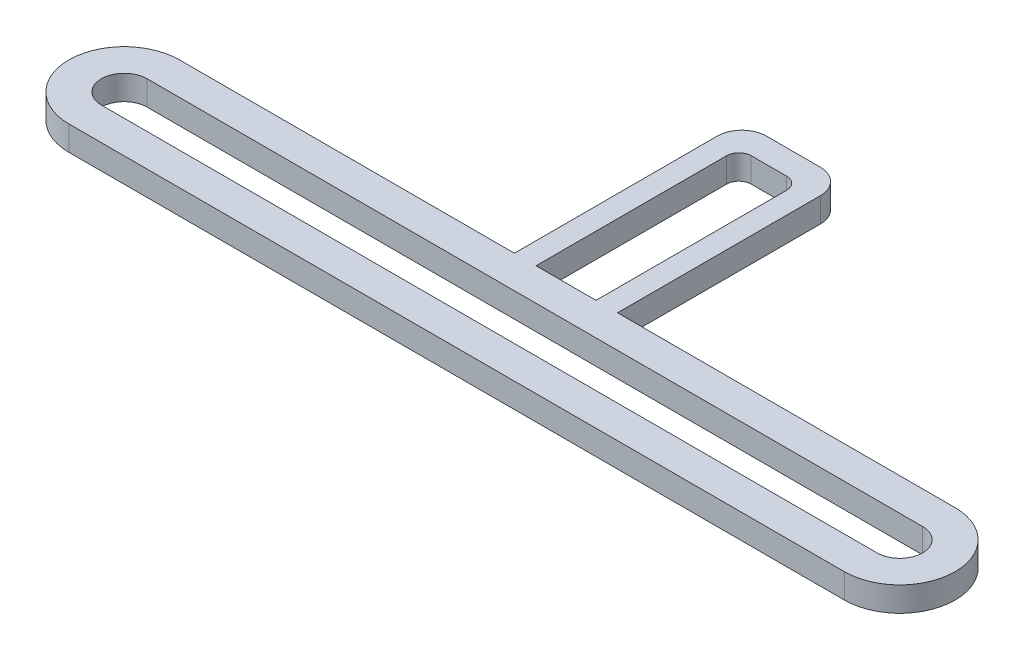
ISO-10303-21;
HEADER;
FILE_DESCRIPTION(('STEP AP214'),'2;1');
FILE_NAME('part.step','',(''),(''),'','','');
FILE_SCHEMA(('AUTOMOTIVE_DESIGN { 1 0 10303 214 1 1 1 1 }'));
ENDSEC;
DATA;
#1=APPLICATION_CONTEXT('core data for automotive mechanical design processes');
#2=APPLICATION_PROTOCOL_DEFINITION('international standard','automotive_design',2000,#1);
#3=PRODUCT_CONTEXT('',#1,'mechanical');
#4=PRODUCT('Part','Part','',(#3));
#5=PRODUCT_RELATED_PRODUCT_CATEGORY('part','',(#4));
#6=PRODUCT_DEFINITION_FORMATION('','',#4);
#7=PRODUCT_DEFINITION_CONTEXT('part definition',#1,'design');
#8=PRODUCT_DEFINITION('design','',#6,#7);
#9=PRODUCT_DEFINITION_SHAPE('','',#8);
#10=(LENGTH_UNIT() NAMED_UNIT(*) SI_UNIT(.MILLI.,.METRE.));
#11=(NAMED_UNIT(*) PLANE_ANGLE_UNIT() SI_UNIT($,.RADIAN.));
#12=(NAMED_UNIT(*) SI_UNIT($,.STERADIAN.) SOLID_ANGLE_UNIT());
#13=UNCERTAINTY_MEASURE_WITH_UNIT(LENGTH_MEASURE(1.E-05),#10,'distance_accuracy_value','');
#14=(GEOMETRIC_REPRESENTATION_CONTEXT(3) GLOBAL_UNCERTAINTY_ASSIGNED_CONTEXT((#13)) GLOBAL_UNIT_ASSIGNED_CONTEXT((#10,
#11,#12)) REPRESENTATION_CONTEXT('',''));
#15=CARTESIAN_POINT('',(0.,0.,0.));
#16=DIRECTION('',(0.,0.,1.));
#17=DIRECTION('',(1.,0.,0.));
#18=AXIS2_PLACEMENT_3D('',#15,#16,#17);
#19=CARTESIAN_POINT('',(-31.8944085465667,2.54,-13.0361355026627));
#20=DIRECTION('',(0.,1.,0.));
#21=DIRECTION('',(0.,0.,1.));
#22=AXIS2_PLACEMENT_3D('',#19,#20,#21);
#23=PLANE('',#22);
#24=CARTESIAN_POINT('',(-31.8944085465667,2.54,-13.0361355026627));
#25=DIRECTION('',(0.,1.,0.));
#26=DIRECTION('',(0.,0.,1.));
#27=AXIS2_PLACEMENT_3D('',#24,#25,#26);
#28=CIRCLE('',#27,5.7185550593657);
#29=CARTESIAN_POINT('',(-31.8944085465667,2.54,-18.7546905620284));
#30=VERTEX_POINT('',#29);
#31=CARTESIAN_POINT('',(-31.8944085465667,2.54,-7.31758044329697));
#32=VERTEX_POINT('',#31);
#33=EDGE_CURVE('E346',#30,#32,#28,.T.);
#34=ORIENTED_EDGE('',*,*,#33,.T.);
#35=DIRECTION('',(1.,0.,0.));
#36=VECTOR('',#35,1.);
#37=CARTESIAN_POINT('',(-31.8944085465667,2.54,-7.31758044329697));
#38=LINE('',#37,#36);
#39=CARTESIAN_POINT('',(48.1634811809157,2.54,-7.31758044329697));
#40=VERTEX_POINT('',#39);
#41=EDGE_CURVE('E351',#32,#40,#38,.T.);
#42=ORIENTED_EDGE('',*,*,#41,.T.);
#43=CARTESIAN_POINT('',(48.1634811809157,2.54,-13.0361355026627));
#44=DIRECTION('',(0.,1.,0.));
#45=DIRECTION('',(0.,0.,1.));
#46=AXIS2_PLACEMENT_3D('',#43,#44,#45);
#47=CIRCLE('',#46,5.7185550593657);
#48=CARTESIAN_POINT('',(48.1634811809157,2.54,-18.7546905620284));
#49=VERTEX_POINT('',#48);
#50=EDGE_CURVE('E353',#40,#49,#47,.T.);
#51=ORIENTED_EDGE('',*,*,#50,.T.);
#52=DIRECTION('',(1.,0.,0.));
#53=VECTOR('',#52,1.);
#54=CARTESIAN_POINT('',(13.3118521904499,2.54,-18.7546905620284));
#55=LINE('',#54,#53);
#56=CARTESIAN_POINT('',(13.3118521904499,2.54,-18.7546905620284));
#57=VERTEX_POINT('',#56);
#58=EDGE_CURVE('E357',#57,#49,#55,.T.);
#59=ORIENTED_EDGE('',*,*,#58,.F.);
#60=DIRECTION('',(0.,0.,-1.));
#61=VECTOR('',#60,1.);
#62=CARTESIAN_POINT('',(13.3118521904499,2.54,-18.7546905620284));
#63=LINE('',#62,#61);
#64=CARTESIAN_POINT('',(13.3118521904499,2.54,-39.6929585233451));
#65=VERTEX_POINT('',#64);
#66=EDGE_CURVE('E356',#57,#65,#63,.T.);
#67=ORIENTED_EDGE('',*,*,#66,.T.);
#68=CARTESIAN_POINT('',(10.7718521904499,2.54,-39.6929585233451));
#69=DIRECTION('',(0.,-1.,0.));
#70=DIRECTION('',(0.,0.,-1.));
#71=AXIS2_PLACEMENT_3D('',#68,#69,#70);
#72=CIRCLE('',#71,2.54);
#73=CARTESIAN_POINT('',(10.7718521904499,2.54,-42.2329585233451));
#74=VERTEX_POINT('',#73);
#75=EDGE_CURVE('E363',#74,#65,#72,.T.);
#76=ORIENTED_EDGE('',*,*,#75,.F.);
#77=DIRECTION('',(1.,0.,0.));
#78=VECTOR('',#77,1.);
#79=CARTESIAN_POINT('',(5.203348375966,2.54,-42.2329585233451));
#80=LINE('',#79,#78);
#81=CARTESIAN_POINT('',(5.203348375966,2.54,-42.2329585233451));
#82=VERTEX_POINT('',#81);
#83=EDGE_CURVE('E365',#82,#74,#80,.T.);
#84=ORIENTED_EDGE('',*,*,#83,.F.);
#85=CARTESIAN_POINT('',(5.20334837596598,2.54,-39.6929585233451));
#86=DIRECTION('',(0.,1.,0.));
#87=DIRECTION('',(0.,0.,1.));
#88=AXIS2_PLACEMENT_3D('',#85,#86,#87);
#89=CIRCLE('',#88,2.54);
#90=CARTESIAN_POINT('',(2.66334837596598,2.54,-39.6929585233451));
#91=VERTEX_POINT('',#90);
#92=EDGE_CURVE('E370',#82,#91,#89,.T.);
#93=ORIENTED_EDGE('',*,*,#92,.T.);
#94=DIRECTION('',(0.,0.,-1.));
#95=VECTOR('',#94,1.);
#96=CARTESIAN_POINT('',(2.66334837596598,2.54,-18.7546905620284));
#97=LINE('',#96,#95);
#98=CARTESIAN_POINT('',(2.66334837596598,2.54,-18.7546905620284));
#99=VERTEX_POINT('',#98);
#100=EDGE_CURVE('E369',#99,#91,#97,.T.);
#101=ORIENTED_EDGE('',*,*,#100,.F.);
#102=DIRECTION('',(1.,0.,0.));
#103=VECTOR('',#102,1.);
#104=CARTESIAN_POINT('',(-31.8944085465667,2.54,-18.7546905620284));
#105=LINE('',#104,#103);
#106=EDGE_CURVE('E375',#30,#99,#105,.T.);
#107=ORIENTED_EDGE('',*,*,#106,.F.);
#108=EDGE_LOOP('',(#34,#42,#51,#59,#67,#76,#84,#93,#101,#107));
#109=FACE_BOUND('',#108,.T.);
#110=DIRECTION('',(0.,0.,-1.));
#111=VECTOR('',#110,1.);
#112=CARTESIAN_POINT('',(11.0866844777407,2.54,-18.7546905620284));
#113=LINE('',#112,#111);
#114=CARTESIAN_POINT('',(11.0866844777407,2.54,-18.7546905620284));
#115=VERTEX_POINT('',#114);
#116=CARTESIAN_POINT('',(11.0866844777407,2.54,-38.4229585233451));
#117=VERTEX_POINT('',#116);
#118=EDGE_CURVE('E304',#115,#117,#113,.T.);
#119=ORIENTED_EDGE('',*,*,#118,.F.);
#120=DIRECTION('',(1.,0.,0.));
#121=VECTOR('',#120,1.);
#122=CARTESIAN_POINT('',(4.90156616485932,2.54,-18.7546905620284));
#123=LINE('',#122,#121);
#124=CARTESIAN_POINT('',(4.90156616485932,2.54,-18.7546905620284));
#125=VERTEX_POINT('',#124);
#126=EDGE_CURVE('E299',#125,#115,#123,.T.);
#127=ORIENTED_EDGE('',*,*,#126,.F.);
#128=DIRECTION('',(0.,0.,-1.));
#129=VECTOR('',#128,1.);
#130=CARTESIAN_POINT('',(4.90156616485932,2.54,-18.7546905620284));
#131=LINE('',#130,#129);
#132=CARTESIAN_POINT('',(4.90156616485932,2.54,-38.4229585233451));
#133=VERTEX_POINT('',#132);
#134=EDGE_CURVE('E314',#125,#133,#131,.T.);
#135=ORIENTED_EDGE('',*,*,#134,.T.);
#136=CARTESIAN_POINT('',(6.17156616485931,2.54,-38.4229585233451));
#137=DIRECTION('',(0.,1.,0.));
#138=DIRECTION('',(0.,0.,1.));
#139=AXIS2_PLACEMENT_3D('',#136,#137,#138);
#140=CIRCLE('',#139,1.27);
#141=CARTESIAN_POINT('',(6.17156616485932,2.54,-39.6929585233451));
#142=VERTEX_POINT('',#141);
#143=EDGE_CURVE('E313',#142,#133,#140,.T.);
#144=ORIENTED_EDGE('',*,*,#143,.F.);
#145=DIRECTION('',(1.,0.,0.));
#146=VECTOR('',#145,1.);
#147=CARTESIAN_POINT('',(6.17156616485932,2.54,-39.6929585233451));
#148=LINE('',#147,#146);
#149=CARTESIAN_POINT('',(9.81668447774072,2.54,-39.6929585233451));
#150=VERTEX_POINT('',#149);
#151=EDGE_CURVE('E306',#142,#150,#148,.T.);
#152=ORIENTED_EDGE('',*,*,#151,.T.);
#153=CARTESIAN_POINT('',(9.81668447774073,2.54,-38.4229585233451));
#154=DIRECTION('',(0.,-1.,0.));
#155=DIRECTION('',(0.,0.,-1.));
#156=AXIS2_PLACEMENT_3D('',#153,#154,#155);
#157=CIRCLE('',#156,1.27);
#158=EDGE_CURVE('E303',#150,#117,#157,.T.);
#159=ORIENTED_EDGE('',*,*,#158,.T.);
#160=EDGE_LOOP('',(#119,#127,#135,#144,#152,#159));
#161=FACE_BOUND('',#160,.T.);
#162=DIRECTION('',(1.,0.,0.));
#163=VECTOR('',#162,1.);
#164=CARTESIAN_POINT('',(-31.8944085465667,2.54,-10.6784856097663));
#165=LINE('',#164,#163);
#166=CARTESIAN_POINT('',(-31.8944085465667,2.54,-10.6784856097663));
#167=VERTEX_POINT('',#166);
#168=CARTESIAN_POINT('',(48.1634811809157,2.54,-10.6784856097663));
#169=VERTEX_POINT('',#168);
#170=EDGE_CURVE('E272',#167,#169,#165,.T.);
#171=ORIENTED_EDGE('',*,*,#170,.F.);
#172=CARTESIAN_POINT('',(-31.8944085465667,2.54,-13.0361355026627));
#173=DIRECTION('',(0.,1.,0.));
#174=DIRECTION('',(0.,0.,1.));
#175=AXIS2_PLACEMENT_3D('',#172,#173,#174);
#176=CIRCLE('',#175,2.35764989289636);
#177=CARTESIAN_POINT('',(-31.8944085465667,2.54,-15.393785395559));
#178=VERTEX_POINT('',#177);
#179=EDGE_CURVE('E264',#178,#167,#176,.T.);
#180=ORIENTED_EDGE('',*,*,#179,.F.);
#181=DIRECTION('',(1.,0.,0.));
#182=VECTOR('',#181,1.);
#183=CARTESIAN_POINT('',(-31.8944085465667,2.54,-15.393785395559));
#184=LINE('',#183,#182);
#185=CARTESIAN_POINT('',(48.1634811809157,2.54,-15.393785395559));
#186=VERTEX_POINT('',#185);
#187=EDGE_CURVE('E289',#178,#186,#184,.T.);
#188=ORIENTED_EDGE('',*,*,#187,.T.);
#189=CARTESIAN_POINT('',(48.1634811809157,2.54,-13.0361355026627));
#190=DIRECTION('',(0.,1.,0.));
#191=DIRECTION('',(0.,0.,1.));
#192=AXIS2_PLACEMENT_3D('',#189,#190,#191);
#193=CIRCLE('',#192,2.35764989289636);
#194=EDGE_CURVE('E284',#169,#186,#193,.T.);
#195=ORIENTED_EDGE('',*,*,#194,.F.);
#196=EDGE_LOOP('',(#171,#180,#188,#195));
#197=FACE_BOUND('',#196,.T.);
#198=ADVANCED_FACE('F126',(#109,#161,#197),#23,.T.);
#199=CARTESIAN_POINT('',(-31.8944085465667,0.,-13.0361355026627));
#200=DIRECTION('',(0.,1.,0.));
#201=DIRECTION('',(0.,0.,1.));
#202=AXIS2_PLACEMENT_3D('',#199,#200,#201);
#203=PLANE('',#202);
#204=DIRECTION('',(1.,0.,0.));
#205=VECTOR('',#204,1.);
#206=CARTESIAN_POINT('',(4.90156616485932,0.,-18.7546905620284));
#207=LINE('',#206,#205);
#208=CARTESIAN_POINT('',(4.90156616485932,0.,-18.7546905620284));
#209=VERTEX_POINT('',#208);
#210=CARTESIAN_POINT('',(11.0866844777407,0.,-18.7546905620284));
#211=VERTEX_POINT('',#210);
#212=EDGE_CURVE('E281',#209,#211,#207,.T.);
#213=ORIENTED_EDGE('',*,*,#212,.T.);
#214=DIRECTION('',(0.,0.,-1.));
#215=VECTOR('',#214,1.);
#216=CARTESIAN_POINT('',(11.0866844777407,0.,-18.7546905620284));
#217=LINE('',#216,#215);
#218=CARTESIAN_POINT('',(11.0866844777407,0.,-38.4229585233451));
#219=VERTEX_POINT('',#218);
#220=EDGE_CURVE('E319',#211,#219,#217,.T.);
#221=ORIENTED_EDGE('',*,*,#220,.T.);
#222=CARTESIAN_POINT('',(9.81668447774073,0.,-38.4229585233451));
#223=DIRECTION('',(0.,-1.,0.));
#224=DIRECTION('',(0.,0.,-1.));
#225=AXIS2_PLACEMENT_3D('',#222,#223,#224);
#226=CIRCLE('',#225,1.27);
#227=CARTESIAN_POINT('',(9.81668447774072,0.,-39.6929585233451));
#228=VERTEX_POINT('',#227);
#229=EDGE_CURVE('E323',#228,#219,#226,.T.);
#230=ORIENTED_EDGE('',*,*,#229,.F.);
#231=DIRECTION('',(1.,0.,0.));
#232=VECTOR('',#231,1.);
#233=CARTESIAN_POINT('',(6.17156616485932,0.,-39.6929585233451));
#234=LINE('',#233,#232);
#235=CARTESIAN_POINT('',(6.17156616485932,0.,-39.6929585233451));
#236=VERTEX_POINT('',#235);
#237=EDGE_CURVE('E326',#236,#228,#234,.T.);
#238=ORIENTED_EDGE('',*,*,#237,.F.);
#239=CARTESIAN_POINT('',(6.17156616485931,0.,-38.4229585233451));
#240=DIRECTION('',(0.,1.,0.));
#241=DIRECTION('',(0.,0.,1.));
#242=AXIS2_PLACEMENT_3D('',#239,#240,#241);
#243=CIRCLE('',#242,1.27);
#244=CARTESIAN_POINT('',(4.90156616485932,0.,-38.4229585233451));
#245=VERTEX_POINT('',#244);
#246=EDGE_CURVE('E328',#236,#245,#243,.T.);
#247=ORIENTED_EDGE('',*,*,#246,.T.);
#248=DIRECTION('',(0.,0.,-1.));
#249=VECTOR('',#248,1.);
#250=CARTESIAN_POINT('',(4.90156616485932,0.,-18.7546905620284));
#251=LINE('',#250,#249);
#252=EDGE_CURVE('E305',#209,#245,#251,.T.);
#253=ORIENTED_EDGE('',*,*,#252,.F.);
#254=EDGE_LOOP('',(#213,#221,#230,#238,#247,#253));
#255=FACE_BOUND('',#254,.T.);
#256=CARTESIAN_POINT('',(-31.8944085465667,0.,-13.0361355026627));
#257=DIRECTION('',(0.,1.,0.));
#258=DIRECTION('',(0.,0.,1.));
#259=AXIS2_PLACEMENT_3D('',#256,#257,#258);
#260=CIRCLE('',#259,5.7185550593657);
#261=CARTESIAN_POINT('',(-31.8944085465667,0.,-18.7546905620284));
#262=VERTEX_POINT('',#261);
#263=CARTESIAN_POINT('',(-31.8944085465667,0.,-7.31758044329697));
#264=VERTEX_POINT('',#263);
#265=EDGE_CURVE('E350',#262,#264,#260,.T.);
#266=ORIENTED_EDGE('',*,*,#265,.F.);
#267=DIRECTION('',(1.,0.,0.));
#268=VECTOR('',#267,1.);
#269=CARTESIAN_POINT('',(-31.8944085465667,0.,-18.7546905620284));
#270=LINE('',#269,#268);
#271=CARTESIAN_POINT('',(2.66334837596598,0.,-18.7546905620284));
#272=VERTEX_POINT('',#271);
#273=EDGE_CURVE('E355',#262,#272,#270,.T.);
#274=ORIENTED_EDGE('',*,*,#273,.T.);
#275=DIRECTION('',(0.,0.,-1.));
#276=VECTOR('',#275,1.);
#277=CARTESIAN_POINT('',(2.66334837596598,0.,-18.7546905620284));
#278=LINE('',#277,#276);
#279=CARTESIAN_POINT('',(2.66334837596598,0.,-39.6929585233451));
#280=VERTEX_POINT('',#279);
#281=EDGE_CURVE('E400',#272,#280,#278,.T.);
#282=ORIENTED_EDGE('',*,*,#281,.T.);
#283=CARTESIAN_POINT('',(5.20334837596598,0.,-39.6929585233451));
#284=DIRECTION('',(0.,1.,0.));
#285=DIRECTION('',(0.,0.,1.));
#286=AXIS2_PLACEMENT_3D('',#283,#284,#285);
#287=CIRCLE('',#286,2.54);
#288=CARTESIAN_POINT('',(5.203348375966,0.,-42.2329585233451));
#289=VERTEX_POINT('',#288);
#290=EDGE_CURVE('E394',#289,#280,#287,.T.);
#291=ORIENTED_EDGE('',*,*,#290,.F.);
#292=DIRECTION('',(1.,0.,0.));
#293=VECTOR('',#292,1.);
#294=CARTESIAN_POINT('',(5.203348375966,0.,-42.2329585233451));
#295=LINE('',#294,#293);
#296=CARTESIAN_POINT('',(10.7718521904499,0.,-42.2329585233451));
#297=VERTEX_POINT('',#296);
#298=EDGE_CURVE('E395',#289,#297,#295,.T.);
#299=ORIENTED_EDGE('',*,*,#298,.T.);
#300=CARTESIAN_POINT('',(10.7718521904499,0.,-39.6929585233451));
#301=DIRECTION('',(0.,-1.,0.));
#302=DIRECTION('',(0.,0.,-1.));
#303=AXIS2_PLACEMENT_3D('',#300,#301,#302);
#304=CIRCLE('',#303,2.54);
#305=CARTESIAN_POINT('',(13.3118521904499,0.,-39.6929585233451));
#306=VERTEX_POINT('',#305);
#307=EDGE_CURVE('E386',#297,#306,#304,.T.);
#308=ORIENTED_EDGE('',*,*,#307,.T.);
#309=DIRECTION('',(0.,0.,-1.));
#310=VECTOR('',#309,1.);
#311=CARTESIAN_POINT('',(13.3118521904499,0.,-18.7546905620284));
#312=LINE('',#311,#310);
#313=CARTESIAN_POINT('',(13.3118521904499,0.,-18.7546905620284));
#314=VERTEX_POINT('',#313);
#315=EDGE_CURVE('E387',#314,#306,#312,.T.);
#316=ORIENTED_EDGE('',*,*,#315,.F.);
#317=DIRECTION('',(1.,0.,0.));
#318=VECTOR('',#317,1.);
#319=CARTESIAN_POINT('',(13.3118521904499,0.,-18.7546905620284));
#320=LINE('',#319,#318);
#321=CARTESIAN_POINT('',(48.1634811809157,0.,-18.7546905620284));
#322=VERTEX_POINT('',#321);
#323=EDGE_CURVE('E382',#314,#322,#320,.T.);
#324=ORIENTED_EDGE('',*,*,#323,.T.);
#325=CARTESIAN_POINT('',(48.1634811809157,0.,-13.0361355026627));
#326=DIRECTION('',(0.,1.,0.));
#327=DIRECTION('',(0.,0.,1.));
#328=AXIS2_PLACEMENT_3D('',#325,#326,#327);
#329=CIRCLE('',#328,5.7185550593657);
#330=CARTESIAN_POINT('',(48.1634811809157,0.,-7.31758044329697));
#331=VERTEX_POINT('',#330);
#332=EDGE_CURVE('E379',#331,#322,#329,.T.);
#333=ORIENTED_EDGE('',*,*,#332,.F.);
#334=DIRECTION('',(1.,0.,0.));
#335=VECTOR('',#334,1.);
#336=CARTESIAN_POINT('',(-31.8944085465667,0.,-7.31758044329697));
#337=LINE('',#336,#335);
#338=EDGE_CURVE('E378',#264,#331,#337,.T.);
#339=ORIENTED_EDGE('',*,*,#338,.F.);
#340=EDGE_LOOP('',(#266,#274,#282,#291,#299,#308,#316,#324,#333,#339));
#341=FACE_BOUND('',#340,.T.);
#342=CARTESIAN_POINT('',(-31.8944085465667,0.,-13.0361355026627));
#343=DIRECTION('',(0.,1.,0.));
#344=DIRECTION('',(0.,0.,1.));
#345=AXIS2_PLACEMENT_3D('',#342,#343,#344);
#346=CIRCLE('',#345,2.35764989289636);
#347=CARTESIAN_POINT('',(-31.8944085465667,0.,-15.393785395559));
#348=VERTEX_POINT('',#347);
#349=CARTESIAN_POINT('',(-31.8944085465667,0.,-10.6784856097663));
#350=VERTEX_POINT('',#349);
#351=EDGE_CURVE('E151',#348,#350,#346,.T.);
#352=ORIENTED_EDGE('',*,*,#351,.T.);
#353=DIRECTION('',(1.,0.,0.));
#354=VECTOR('',#353,1.);
#355=CARTESIAN_POINT('',(-31.8944085465667,0.,-10.6784856097663));
#356=LINE('',#355,#354);
#357=CARTESIAN_POINT('',(48.1634811809157,0.,-10.6784856097663));
#358=VERTEX_POINT('',#357);
#359=EDGE_CURVE('E278',#350,#358,#356,.T.);
#360=ORIENTED_EDGE('',*,*,#359,.T.);
#361=CARTESIAN_POINT('',(48.1634811809157,0.,-13.0361355026627));
#362=DIRECTION('',(0.,1.,0.));
#363=DIRECTION('',(0.,0.,1.));
#364=AXIS2_PLACEMENT_3D('',#361,#362,#363);
#365=CIRCLE('',#364,2.35764989289636);
#366=CARTESIAN_POINT('',(48.1634811809157,0.,-15.393785395559));
#367=VERTEX_POINT('',#366);
#368=EDGE_CURVE('E291',#358,#367,#365,.T.);
#369=ORIENTED_EDGE('',*,*,#368,.T.);
#370=DIRECTION('',(1.,0.,0.));
#371=VECTOR('',#370,1.);
#372=CARTESIAN_POINT('',(-31.8944085465667,0.,-15.393785395559));
#373=LINE('',#372,#371);
#374=EDGE_CURVE('E273',#348,#367,#373,.T.);
#375=ORIENTED_EDGE('',*,*,#374,.F.);
#376=EDGE_LOOP('',(#352,#360,#369,#375));
#377=FACE_BOUND('',#376,.T.);
#378=ADVANCED_FACE('F430',(#255,#341,#377),#203,.F.);
#379=CARTESIAN_POINT('',(-31.8944085465667,2.54,-13.0361355026627));
#380=DIRECTION('',(0.,-1.,0.));
#381=DIRECTION('',(0.,0.,-1.));
#382=AXIS2_PLACEMENT_3D('',#379,#380,#381);
#383=CYLINDRICAL_SURFACE('',#382,5.7185550593657);
#384=ORIENTED_EDGE('',*,*,#265,.T.);
#385=DIRECTION('',(0.,-1.,0.));
#386=VECTOR('',#385,1.);
#387=CARTESIAN_POINT('',(-31.8944085465667,2.54,-7.31758044329697));
#388=LINE('',#387,#386);
#389=EDGE_CURVE('E12',#32,#264,#388,.T.);
#390=ORIENTED_EDGE('',*,*,#389,.F.);
#391=ORIENTED_EDGE('',*,*,#33,.F.);
#392=DIRECTION('',(0.,-1.,0.));
#393=VECTOR('',#392,1.);
#394=CARTESIAN_POINT('',(-31.8944085465667,2.54,-18.7546905620284));
#395=LINE('',#394,#393);
#396=EDGE_CURVE('E374',#30,#262,#395,.T.);
#397=ORIENTED_EDGE('',*,*,#396,.T.);
#398=EDGE_LOOP('',(#384,#390,#391,#397));
#399=FACE_BOUND('',#398,.T.);
#400=ADVANCED_FACE('F128',(#399),#383,.T.);
#401=CARTESIAN_POINT('',(-31.8944085465667,2.54,-7.31758044329697));
#402=DIRECTION('',(0.,0.,-1.));
#403=DIRECTION('',(-1.,0.,0.));
#404=AXIS2_PLACEMENT_3D('',#401,#402,#403);
#405=PLANE('',#404);
#406=ORIENTED_EDGE('',*,*,#338,.T.);
#407=DIRECTION('',(0.,-1.,0.));
#408=VECTOR('',#407,1.);
#409=CARTESIAN_POINT('',(48.1634811809157,2.54,-7.31758044329697));
#410=LINE('',#409,#408);
#411=EDGE_CURVE('E137',#40,#331,#410,.T.);
#412=ORIENTED_EDGE('',*,*,#411,.F.);
#413=ORIENTED_EDGE('',*,*,#41,.F.);
#414=ORIENTED_EDGE('',*,*,#389,.T.);
#415=EDGE_LOOP('',(#406,#412,#413,#414));
#416=FACE_BOUND('',#415,.T.);
#417=ADVANCED_FACE('F445',(#416),#405,.F.);
#418=CARTESIAN_POINT('',(48.1634811809157,2.54,-13.0361355026627));
#419=DIRECTION('',(0.,-1.,0.));
#420=DIRECTION('',(0.,0.,-1.));
#421=AXIS2_PLACEMENT_3D('',#418,#419,#420);
#422=CYLINDRICAL_SURFACE('',#421,5.7185550593657);
#423=ORIENTED_EDGE('',*,*,#332,.T.);
#424=DIRECTION('',(0.,-1.,0.));
#425=VECTOR('',#424,1.);
#426=CARTESIAN_POINT('',(48.1634811809157,2.54,-18.7546905620284));
#427=LINE('',#426,#425);
#428=EDGE_CURVE('E418',#49,#322,#427,.T.);
#429=ORIENTED_EDGE('',*,*,#428,.F.);
#430=ORIENTED_EDGE('',*,*,#50,.F.);
#431=ORIENTED_EDGE('',*,*,#411,.T.);
#432=EDGE_LOOP('',(#423,#429,#430,#431));
#433=FACE_BOUND('',#432,.T.);
#434=ADVANCED_FACE('F425',(#433),#422,.T.);
#435=CARTESIAN_POINT('',(13.3118521904499,2.54,-18.7546905620284));
#436=DIRECTION('',(0.,0.,-1.));
#437=DIRECTION('',(-1.,0.,0.));
#438=AXIS2_PLACEMENT_3D('',#435,#436,#437);
#439=PLANE('',#438);
#440=ORIENTED_EDGE('',*,*,#323,.F.);
#441=DIRECTION('',(0.,-1.,0.));
#442=VECTOR('',#441,1.);
#443=CARTESIAN_POINT('',(13.3118521904499,2.54,-18.7546905620284));
#444=LINE('',#443,#442);
#445=EDGE_CURVE('E411',#57,#314,#444,.T.);
#446=ORIENTED_EDGE('',*,*,#445,.F.);
#447=ORIENTED_EDGE('',*,*,#58,.T.);
#448=ORIENTED_EDGE('',*,*,#428,.T.);
#449=EDGE_LOOP('',(#440,#446,#447,#448));
#450=FACE_BOUND('',#449,.T.);
#451=ADVANCED_FACE('F435',(#450),#439,.T.);
#452=CARTESIAN_POINT('',(13.3118521904499,2.54,-18.7546905620284));
#453=DIRECTION('',(-1.,0.,0.));
#454=DIRECTION('',(0.,0.,1.));
#455=AXIS2_PLACEMENT_3D('',#452,#453,#454);
#456=PLANE('',#455);
#457=ORIENTED_EDGE('',*,*,#315,.T.);
#458=DIRECTION('',(0.,-1.,0.));
#459=VECTOR('',#458,1.);
#460=CARTESIAN_POINT('',(13.3118521904499,2.54,-39.6929585233451));
#461=LINE('',#460,#459);
#462=EDGE_CURVE('E414',#65,#306,#461,.T.);
#463=ORIENTED_EDGE('',*,*,#462,.F.);
#464=ORIENTED_EDGE('',*,*,#66,.F.);
#465=ORIENTED_EDGE('',*,*,#445,.T.);
#466=EDGE_LOOP('',(#457,#463,#464,#465));
#467=FACE_BOUND('',#466,.T.);
#468=ADVANCED_FACE('F462',(#467),#456,.F.);
#469=CARTESIAN_POINT('',(10.7718521904499,2.54,-39.6929585233451));
#470=DIRECTION('',(0.,-1.,0.));
#471=DIRECTION('',(0.,0.,-1.));
#472=AXIS2_PLACEMENT_3D('',#469,#470,#471);
#473=CYLINDRICAL_SURFACE('',#472,2.54);
#474=ORIENTED_EDGE('',*,*,#307,.F.);
#475=DIRECTION('',(0.,-1.,0.));
#476=VECTOR('',#475,1.);
#477=CARTESIAN_POINT('',(10.7718521904499,2.54,-42.2329585233451));
#478=LINE('',#477,#476);
#479=EDGE_CURVE('E409',#74,#297,#478,.T.);
#480=ORIENTED_EDGE('',*,*,#479,.F.);
#481=ORIENTED_EDGE('',*,*,#75,.T.);
#482=ORIENTED_EDGE('',*,*,#462,.T.);
#483=EDGE_LOOP('',(#474,#480,#481,#482));
#484=FACE_BOUND('',#483,.T.);
#485=ADVANCED_FACE('F461',(#484),#473,.T.);
#486=CARTESIAN_POINT('',(5.203348375966,2.54,-42.2329585233451));
#487=DIRECTION('',(0.,0.,-1.));
#488=DIRECTION('',(-1.,0.,0.));
#489=AXIS2_PLACEMENT_3D('',#486,#487,#488);
#490=PLANE('',#489);
#491=ORIENTED_EDGE('',*,*,#298,.F.);
#492=DIRECTION('',(0.,-1.,0.));
#493=VECTOR('',#492,1.);
#494=CARTESIAN_POINT('',(5.203348375966,2.54,-42.2329585233451));
#495=LINE('',#494,#493);
#496=EDGE_CURVE('E407',#82,#289,#495,.T.);
#497=ORIENTED_EDGE('',*,*,#496,.F.);
#498=ORIENTED_EDGE('',*,*,#83,.T.);
#499=ORIENTED_EDGE('',*,*,#479,.T.);
#500=EDGE_LOOP('',(#491,#497,#498,#499));
#501=FACE_BOUND('',#500,.T.);
#502=ADVANCED_FACE('F457',(#501),#490,.T.);
#503=CARTESIAN_POINT('',(5.20334837596598,2.54,-39.6929585233451));
#504=DIRECTION('',(0.,-1.,0.));
#505=DIRECTION('',(0.,0.,-1.));
#506=AXIS2_PLACEMENT_3D('',#503,#504,#505);
#507=CYLINDRICAL_SURFACE('',#506,2.54);
#508=ORIENTED_EDGE('',*,*,#290,.T.);
#509=DIRECTION('',(0.,-1.,0.));
#510=VECTOR('',#509,1.);
#511=CARTESIAN_POINT('',(2.66334837596598,2.54,-39.6929585233451));
#512=LINE('',#511,#510);
#513=EDGE_CURVE('E406',#91,#280,#512,.T.);
#514=ORIENTED_EDGE('',*,*,#513,.F.);
#515=ORIENTED_EDGE('',*,*,#92,.F.);
#516=ORIENTED_EDGE('',*,*,#496,.T.);
#517=EDGE_LOOP('',(#508,#514,#515,#516));
#518=FACE_BOUND('',#517,.T.);
#519=ADVANCED_FACE('F490',(#518),#507,.T.);
#520=CARTESIAN_POINT('',(2.66334837596598,2.54,-18.7546905620284));
#521=DIRECTION('',(-1.,0.,0.));
#522=DIRECTION('',(0.,0.,1.));
#523=AXIS2_PLACEMENT_3D('',#520,#521,#522);
#524=PLANE('',#523);
#525=ORIENTED_EDGE('',*,*,#281,.F.);
#526=DIRECTION('',(0.,-1.,0.));
#527=VECTOR('',#526,1.);
#528=CARTESIAN_POINT('',(2.66334837596598,2.54,-18.7546905620284));
#529=LINE('',#528,#527);
#530=EDGE_CURVE('E404',#99,#272,#529,.T.);
#531=ORIENTED_EDGE('',*,*,#530,.F.);
#532=ORIENTED_EDGE('',*,*,#100,.T.);
#533=ORIENTED_EDGE('',*,*,#513,.T.);
#534=EDGE_LOOP('',(#525,#531,#532,#533));
#535=FACE_BOUND('',#534,.T.);
#536=ADVANCED_FACE('F449',(#535),#524,.T.);
#537=CARTESIAN_POINT('',(-31.8944085465667,2.54,-18.7546905620284));
#538=DIRECTION('',(0.,0.,-1.));
#539=DIRECTION('',(-1.,0.,0.));
#540=AXIS2_PLACEMENT_3D('',#537,#538,#539);
#541=PLANE('',#540);
#542=ORIENTED_EDGE('',*,*,#273,.F.);
#543=ORIENTED_EDGE('',*,*,#396,.F.);
#544=ORIENTED_EDGE('',*,*,#106,.T.);
#545=ORIENTED_EDGE('',*,*,#530,.T.);
#546=EDGE_LOOP('',(#542,#543,#544,#545));
#547=FACE_BOUND('',#546,.T.);
#548=ADVANCED_FACE('F446',(#547),#541,.T.);
#549=CARTESIAN_POINT('',(4.90156616485932,2.54,-18.7546905620284));
#550=DIRECTION('',(0.,0.,-1.));
#551=DIRECTION('',(-1.,0.,0.));
#552=AXIS2_PLACEMENT_3D('',#549,#550,#551);
#553=PLANE('',#552);
#554=ORIENTED_EDGE('',*,*,#212,.F.);
#555=DIRECTION('',(0.,-1.,0.));
#556=VECTOR('',#555,1.);
#557=CARTESIAN_POINT('',(4.90156616485932,2.54,-18.7546905620284));
#558=LINE('',#557,#556);
#559=EDGE_CURVE('E320',#125,#209,#558,.T.);
#560=ORIENTED_EDGE('',*,*,#559,.F.);
#561=ORIENTED_EDGE('',*,*,#126,.T.);
#562=DIRECTION('',(0.,-1.,0.));
#563=VECTOR('',#562,1.);
#564=CARTESIAN_POINT('',(11.0866844777407,2.54,-18.7546905620284));
#565=LINE('',#564,#563);
#566=EDGE_CURVE('E341',#115,#211,#565,.T.);
#567=ORIENTED_EDGE('',*,*,#566,.T.);
#568=EDGE_LOOP('',(#554,#560,#561,#567));
#569=FACE_BOUND('',#568,.T.);
#570=ADVANCED_FACE('F477',(#569),#553,.T.);
#571=CARTESIAN_POINT('',(11.0866844777407,2.54,-18.7546905620284));
#572=DIRECTION('',(-1.,0.,0.));
#573=DIRECTION('',(0.,0.,1.));
#574=AXIS2_PLACEMENT_3D('',#571,#572,#573);
#575=PLANE('',#574);
#576=ORIENTED_EDGE('',*,*,#220,.F.);
#577=ORIENTED_EDGE('',*,*,#566,.F.);
#578=ORIENTED_EDGE('',*,*,#118,.T.);
#579=DIRECTION('',(0.,-1.,0.));
#580=VECTOR('',#579,1.);
#581=CARTESIAN_POINT('',(11.0866844777407,2.54,-38.4229585233451));
#582=LINE('',#581,#580);
#583=EDGE_CURVE('E344',#117,#219,#582,.T.);
#584=ORIENTED_EDGE('',*,*,#583,.T.);
#585=EDGE_LOOP('',(#576,#577,#578,#584));
#586=FACE_BOUND('',#585,.T.);
#587=ADVANCED_FACE('F520',(#586),#575,.T.);
#588=CARTESIAN_POINT('',(9.81668447774073,2.54,-38.4229585233451));
#589=DIRECTION('',(0.,-1.,0.));
#590=DIRECTION('',(0.,0.,-1.));
#591=AXIS2_PLACEMENT_3D('',#588,#589,#590);
#592=CYLINDRICAL_SURFACE('',#591,1.27);
#593=ORIENTED_EDGE('',*,*,#229,.T.);
#594=ORIENTED_EDGE('',*,*,#583,.F.);
#595=ORIENTED_EDGE('',*,*,#158,.F.);
#596=DIRECTION('',(0.,-1.,0.));
#597=VECTOR('',#596,1.);
#598=CARTESIAN_POINT('',(9.81668447774072,2.54,-39.6929585233451));
#599=LINE('',#598,#597);
#600=EDGE_CURVE('E339',#150,#228,#599,.T.);
#601=ORIENTED_EDGE('',*,*,#600,.T.);
#602=EDGE_LOOP('',(#593,#594,#595,#601));
#603=FACE_BOUND('',#602,.T.);
#604=ADVANCED_FACE('F523',(#603),#592,.F.);
#605=CARTESIAN_POINT('',(6.17156616485932,2.54,-39.6929585233451));
#606=DIRECTION('',(0.,0.,-1.));
#607=DIRECTION('',(-1.,0.,0.));
#608=AXIS2_PLACEMENT_3D('',#605,#606,#607);
#609=PLANE('',#608);
#610=ORIENTED_EDGE('',*,*,#237,.T.);
#611=ORIENTED_EDGE('',*,*,#600,.F.);
#612=ORIENTED_EDGE('',*,*,#151,.F.);
#613=DIRECTION('',(0.,-1.,0.));
#614=VECTOR('',#613,1.);
#615=CARTESIAN_POINT('',(6.17156616485932,2.54,-39.6929585233451));
#616=LINE('',#615,#614);
#617=EDGE_CURVE('E337',#142,#236,#616,.T.);
#618=ORIENTED_EDGE('',*,*,#617,.T.);
#619=EDGE_LOOP('',(#610,#611,#612,#618));
#620=FACE_BOUND('',#619,.T.);
#621=ADVANCED_FACE('F531',(#620),#609,.F.);
#622=CARTESIAN_POINT('',(6.17156616485931,2.54,-38.4229585233451));
#623=DIRECTION('',(0.,-1.,0.));
#624=DIRECTION('',(0.,0.,-1.));
#625=AXIS2_PLACEMENT_3D('',#622,#623,#624);
#626=CYLINDRICAL_SURFACE('',#625,1.27);
#627=ORIENTED_EDGE('',*,*,#246,.F.);
#628=ORIENTED_EDGE('',*,*,#617,.F.);
#629=ORIENTED_EDGE('',*,*,#143,.T.);
#630=DIRECTION('',(0.,-1.,0.));
#631=VECTOR('',#630,1.);
#632=CARTESIAN_POINT('',(4.90156616485932,2.54,-38.4229585233451));
#633=LINE('',#632,#631);
#634=EDGE_CURVE('E336',#133,#245,#633,.T.);
#635=ORIENTED_EDGE('',*,*,#634,.T.);
#636=EDGE_LOOP('',(#627,#628,#629,#635));
#637=FACE_BOUND('',#636,.T.);
#638=ADVANCED_FACE('F545',(#637),#626,.F.);
#639=CARTESIAN_POINT('',(4.90156616485932,2.54,-18.7546905620284));
#640=DIRECTION('',(-1.,0.,0.));
#641=DIRECTION('',(0.,0.,1.));
#642=AXIS2_PLACEMENT_3D('',#639,#640,#641);
#643=PLANE('',#642);
#644=ORIENTED_EDGE('',*,*,#252,.T.);
#645=ORIENTED_EDGE('',*,*,#634,.F.);
#646=ORIENTED_EDGE('',*,*,#134,.F.);
#647=ORIENTED_EDGE('',*,*,#559,.T.);
#648=EDGE_LOOP('',(#644,#645,#646,#647));
#649=FACE_BOUND('',#648,.T.);
#650=ADVANCED_FACE('F552',(#649),#643,.F.);
#651=CARTESIAN_POINT('',(-31.8944085465667,2.54,-13.0361355026627));
#652=DIRECTION('',(0.,-1.,0.));
#653=DIRECTION('',(0.,0.,-1.));
#654=AXIS2_PLACEMENT_3D('',#651,#652,#653);
#655=CYLINDRICAL_SURFACE('',#654,2.35764989289636);
#656=ORIENTED_EDGE('',*,*,#351,.F.);
#657=DIRECTION('',(0.,-1.,0.));
#658=VECTOR('',#657,1.);
#659=CARTESIAN_POINT('',(-31.8944085465667,2.54,-15.393785395559));
#660=LINE('',#659,#658);
#661=EDGE_CURVE('E267',#178,#348,#660,.T.);
#662=ORIENTED_EDGE('',*,*,#661,.F.);
#663=ORIENTED_EDGE('',*,*,#179,.T.);
#664=DIRECTION('',(0.,-1.,0.));
#665=VECTOR('',#664,1.);
#666=CARTESIAN_POINT('',(-31.8944085465667,2.54,-10.6784856097663));
#667=LINE('',#666,#665);
#668=EDGE_CURVE('E268',#167,#350,#667,.T.);
#669=ORIENTED_EDGE('',*,*,#668,.T.);
#670=EDGE_LOOP('',(#656,#662,#663,#669));
#671=FACE_BOUND('',#670,.T.);
#672=ADVANCED_FACE('F270',(#671),#655,.F.);
#673=CARTESIAN_POINT('',(-31.8944085465667,2.54,-10.6784856097663));
#674=DIRECTION('',(0.,0.,-1.));
#675=DIRECTION('',(-1.,0.,0.));
#676=AXIS2_PLACEMENT_3D('',#673,#674,#675);
#677=PLANE('',#676);
#678=ORIENTED_EDGE('',*,*,#359,.F.);
#679=ORIENTED_EDGE('',*,*,#668,.F.);
#680=ORIENTED_EDGE('',*,*,#170,.T.);
#681=DIRECTION('',(0.,-1.,0.));
#682=VECTOR('',#681,1.);
#683=CARTESIAN_POINT('',(48.1634811809157,2.54,-10.6784856097663));
#684=LINE('',#683,#682);
#685=EDGE_CURVE('E285',#169,#358,#684,.T.);
#686=ORIENTED_EDGE('',*,*,#685,.T.);
#687=EDGE_LOOP('',(#678,#679,#680,#686));
#688=FACE_BOUND('',#687,.T.);
#689=ADVANCED_FACE('F280',(#688),#677,.T.);
#690=CARTESIAN_POINT('',(48.1634811809157,2.54,-13.0361355026627));
#691=DIRECTION('',(0.,-1.,0.));
#692=DIRECTION('',(0.,0.,-1.));
#693=AXIS2_PLACEMENT_3D('',#690,#691,#692);
#694=CYLINDRICAL_SURFACE('',#693,2.35764989289636);
#695=ORIENTED_EDGE('',*,*,#368,.F.);
#696=ORIENTED_EDGE('',*,*,#685,.F.);
#697=ORIENTED_EDGE('',*,*,#194,.T.);
#698=DIRECTION('',(0.,-1.,0.));
#699=VECTOR('',#698,1.);
#700=CARTESIAN_POINT('',(48.1634811809157,2.54,-15.393785395559));
#701=LINE('',#700,#699);
#702=EDGE_CURVE('E141',#186,#367,#701,.T.);
#703=ORIENTED_EDGE('',*,*,#702,.T.);
#704=EDGE_LOOP('',(#695,#696,#697,#703));
#705=FACE_BOUND('',#704,.T.);
#706=ADVANCED_FACE('F574',(#705),#694,.F.);
#707=CARTESIAN_POINT('',(-31.8944085465667,2.54,-15.393785395559));
#708=DIRECTION('',(0.,0.,-1.));
#709=DIRECTION('',(-1.,0.,0.));
#710=AXIS2_PLACEMENT_3D('',#707,#708,#709);
#711=PLANE('',#710);
#712=ORIENTED_EDGE('',*,*,#374,.T.);
#713=ORIENTED_EDGE('',*,*,#702,.F.);
#714=ORIENTED_EDGE('',*,*,#187,.F.);
#715=ORIENTED_EDGE('',*,*,#661,.T.);
#716=EDGE_LOOP('',(#712,#713,#714,#715));
#717=FACE_BOUND('',#716,.T.);
#718=ADVANCED_FACE('F581',(#717),#711,.F.);
#719=CLOSED_SHELL('',(#198,#378,#400,#417,#434,#451,#468,#485,#502,#519,#536,#548,#570,#587,
#604,#621,#638,#650,#672,#689,#706,#718));
#720=MANIFOLD_SOLID_BREP('B2',#719);
#721=ADVANCED_BREP_SHAPE_REPRESENTATION('',(#18,#720),#14);
#722=SHAPE_DEFINITION_REPRESENTATION(#9,#721);
ENDSEC;
END-ISO-10303-21;
